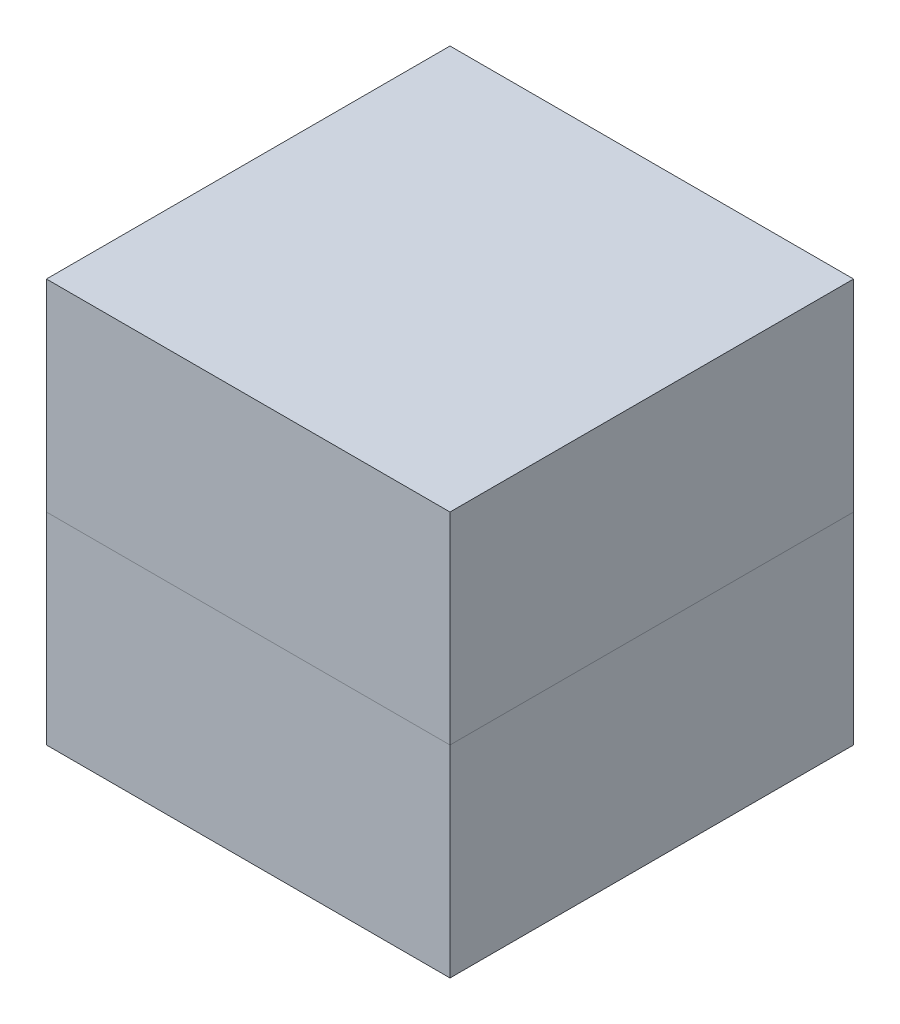
ISO-10303-21;
HEADER;
FILE_DESCRIPTION(('STEP AP214'),'2;1');
FILE_NAME('part.step','',(''),(''),'','','');
FILE_SCHEMA(('AUTOMOTIVE_DESIGN { 1 0 10303 214 1 1 1 1 }'));
ENDSEC;
DATA;
#1=APPLICATION_CONTEXT('core data for automotive mechanical design processes');
#2=APPLICATION_PROTOCOL_DEFINITION('international standard','automotive_design',2000,#1);
#3=PRODUCT_CONTEXT('',#1,'mechanical');
#4=PRODUCT('Part','Part','',(#3));
#5=PRODUCT_RELATED_PRODUCT_CATEGORY('part','',(#4));
#6=PRODUCT_DEFINITION_FORMATION('','',#4);
#7=PRODUCT_DEFINITION_CONTEXT('part definition',#1,'design');
#8=PRODUCT_DEFINITION('design','',#6,#7);
#9=PRODUCT_DEFINITION_SHAPE('','',#8);
#10=(LENGTH_UNIT() NAMED_UNIT(*) SI_UNIT(.MILLI.,.METRE.));
#11=(NAMED_UNIT(*) PLANE_ANGLE_UNIT() SI_UNIT($,.RADIAN.));
#12=(NAMED_UNIT(*) SI_UNIT($,.STERADIAN.) SOLID_ANGLE_UNIT());
#13=UNCERTAINTY_MEASURE_WITH_UNIT(LENGTH_MEASURE(1.E-05),#10,'distance_accuracy_value','');
#14=(GEOMETRIC_REPRESENTATION_CONTEXT(3) GLOBAL_UNCERTAINTY_ASSIGNED_CONTEXT((#13)) GLOBAL_UNIT_ASSIGNED_CONTEXT((#10,
#11,#12)) REPRESENTATION_CONTEXT('',''));
#15=CARTESIAN_POINT('',(0.,0.,0.));
#16=DIRECTION('',(0.,0.,1.));
#17=DIRECTION('',(1.,0.,0.));
#18=AXIS2_PLACEMENT_3D('',#15,#16,#17);
#19=CARTESIAN_POINT('',(0.,-50.,0.));
#20=DIRECTION('',(0.,-1.,0.));
#21=DIRECTION('',(0.,0.,-1.));
#22=AXIS2_PLACEMENT_3D('',#19,#20,#21);
#23=PLANE('',#22);
#24=DIRECTION('',(0.,0.,1.));
#25=VECTOR('',#24,1.);
#26=CARTESIAN_POINT('',(50.,-50.,50.));
#27=LINE('',#26,#25);
#28=CARTESIAN_POINT('',(50.,-50.,-50.));
#29=VERTEX_POINT('',#28);
#30=CARTESIAN_POINT('',(50.,-50.,50.));
#31=VERTEX_POINT('',#30);
#32=EDGE_CURVE('E184',#29,#31,#27,.T.);
#33=ORIENTED_EDGE('',*,*,#32,.T.);
#34=DIRECTION('',(-1.,0.,0.));
#35=VECTOR('',#34,1.);
#36=CARTESIAN_POINT('',(-50.,-50.,50.));
#37=LINE('',#36,#35);
#38=CARTESIAN_POINT('',(-50.,-50.,50.));
#39=VERTEX_POINT('',#38);
#40=EDGE_CURVE('E191',#31,#39,#37,.T.);
#41=ORIENTED_EDGE('',*,*,#40,.T.);
#42=DIRECTION('',(0.,0.,-1.));
#43=VECTOR('',#42,1.);
#44=CARTESIAN_POINT('',(-50.,-50.,50.));
#45=LINE('',#44,#43);
#46=CARTESIAN_POINT('',(-50.,-50.,-50.));
#47=VERTEX_POINT('',#46);
#48=EDGE_CURVE('E197',#39,#47,#45,.T.);
#49=ORIENTED_EDGE('',*,*,#48,.T.);
#50=DIRECTION('',(1.,0.,0.));
#51=VECTOR('',#50,1.);
#52=CARTESIAN_POINT('',(-50.,-50.,-50.));
#53=LINE('',#52,#51);
#54=EDGE_CURVE('E189',#47,#29,#53,.T.);
#55=ORIENTED_EDGE('',*,*,#54,.T.);
#56=EDGE_LOOP('',(#33,#41,#49,#55));
#57=FACE_BOUND('',#56,.T.);
#58=ADVANCED_FACE('F138',(#57),#23,.T.);
#59=CARTESIAN_POINT('',(-50.,50.,50.));
#60=DIRECTION('',(0.,0.,1.));
#61=DIRECTION('',(0.,-1.,0.));
#62=AXIS2_PLACEMENT_3D('',#59,#60,#61);
#63=PLANE('',#62);
#64=DIRECTION('',(0.,-1.,0.));
#65=VECTOR('',#64,1.);
#66=CARTESIAN_POINT('',(50.,50.,50.));
#67=LINE('',#66,#65);
#68=CARTESIAN_POINT('',(50.,0.,50.));
#69=VERTEX_POINT('',#68);
#70=EDGE_CURVE('E180',#69,#31,#67,.T.);
#71=ORIENTED_EDGE('',*,*,#70,.F.);
#72=DIRECTION('',(-1.,0.,0.));
#73=VECTOR('',#72,1.);
#74=CARTESIAN_POINT('',(-50.,0.,50.));
#75=LINE('',#74,#73);
#76=CARTESIAN_POINT('',(-50.,0.,50.));
#77=VERTEX_POINT('',#76);
#78=EDGE_CURVE('E142',#69,#77,#75,.T.);
#79=ORIENTED_EDGE('',*,*,#78,.T.);
#80=DIRECTION('',(0.,-1.,0.));
#81=VECTOR('',#80,1.);
#82=CARTESIAN_POINT('',(-50.,50.,50.));
#83=LINE('',#82,#81);
#84=EDGE_CURVE('E188',#77,#39,#83,.T.);
#85=ORIENTED_EDGE('',*,*,#84,.T.);
#86=ORIENTED_EDGE('',*,*,#40,.F.);
#87=EDGE_LOOP('',(#71,#79,#85,#86));
#88=FACE_BOUND('',#87,.T.);
#89=ADVANCED_FACE('F192',(#88),#63,.T.);
#90=CARTESIAN_POINT('',(-50.,50.,50.));
#91=DIRECTION('',(-1.,0.,0.));
#92=DIRECTION('',(0.,0.,1.));
#93=AXIS2_PLACEMENT_3D('',#90,#91,#92);
#94=PLANE('',#93);
#95=ORIENTED_EDGE('',*,*,#84,.F.);
#96=DIRECTION('',(0.,0.,-1.));
#97=VECTOR('',#96,1.);
#98=CARTESIAN_POINT('',(-50.,0.,50.));
#99=LINE('',#98,#97);
#100=CARTESIAN_POINT('',(-50.,0.,-50.));
#101=VERTEX_POINT('',#100);
#102=EDGE_CURVE('E213',#77,#101,#99,.T.);
#103=ORIENTED_EDGE('',*,*,#102,.T.);
#104=DIRECTION('',(0.,-1.,0.));
#105=VECTOR('',#104,1.);
#106=CARTESIAN_POINT('',(-50.,50.,-50.));
#107=LINE('',#106,#105);
#108=EDGE_CURVE('E208',#101,#47,#107,.T.);
#109=ORIENTED_EDGE('',*,*,#108,.T.);
#110=ORIENTED_EDGE('',*,*,#48,.F.);
#111=EDGE_LOOP('',(#95,#103,#109,#110));
#112=FACE_BOUND('',#111,.T.);
#113=ADVANCED_FACE('F212',(#112),#94,.T.);
#114=CARTESIAN_POINT('',(-50.,50.,-50.));
#115=DIRECTION('',(0.,0.,-1.));
#116=DIRECTION('',(0.,1.,0.));
#117=AXIS2_PLACEMENT_3D('',#114,#115,#116);
#118=PLANE('',#117);
#119=ORIENTED_EDGE('',*,*,#108,.F.);
#120=DIRECTION('',(1.,0.,0.));
#121=VECTOR('',#120,1.);
#122=CARTESIAN_POINT('',(-50.,0.,-50.));
#123=LINE('',#122,#121);
#124=CARTESIAN_POINT('',(50.,0.,-50.));
#125=VERTEX_POINT('',#124);
#126=EDGE_CURVE('E160',#101,#125,#123,.T.);
#127=ORIENTED_EDGE('',*,*,#126,.T.);
#128=DIRECTION('',(0.,-1.,0.));
#129=VECTOR('',#128,1.);
#130=CARTESIAN_POINT('',(50.,50.,-50.));
#131=LINE('',#130,#129);
#132=EDGE_CURVE('E206',#125,#29,#131,.T.);
#133=ORIENTED_EDGE('',*,*,#132,.T.);
#134=ORIENTED_EDGE('',*,*,#54,.F.);
#135=EDGE_LOOP('',(#119,#127,#133,#134));
#136=FACE_BOUND('',#135,.T.);
#137=ADVANCED_FACE('F215',(#136),#118,.T.);
#138=CARTESIAN_POINT('',(50.,50.,50.));
#139=DIRECTION('',(1.,0.,0.));
#140=DIRECTION('',(0.,0.,-1.));
#141=AXIS2_PLACEMENT_3D('',#138,#139,#140);
#142=PLANE('',#141);
#143=ORIENTED_EDGE('',*,*,#132,.F.);
#144=DIRECTION('',(0.,0.,1.));
#145=VECTOR('',#144,1.);
#146=CARTESIAN_POINT('',(50.,0.,50.));
#147=LINE('',#146,#145);
#148=EDGE_CURVE('E186',#125,#69,#147,.T.);
#149=ORIENTED_EDGE('',*,*,#148,.T.);
#150=ORIENTED_EDGE('',*,*,#70,.T.);
#151=ORIENTED_EDGE('',*,*,#32,.F.);
#152=EDGE_LOOP('',(#143,#149,#150,#151));
#153=FACE_BOUND('',#152,.T.);
#154=ADVANCED_FACE('F140',(#153),#142,.T.);
#155=CARTESIAN_POINT('',(0.,-4.,0.));
#156=DIRECTION('',(0.,-1.,0.));
#157=DIRECTION('',(0.,0.,-1.));
#158=AXIS2_PLACEMENT_3D('',#155,#156,#157);
#159=PLANE('',#158);
#160=CARTESIAN_POINT('',(0.,-4.,0.));
#161=DIRECTION('',(0.,1.,0.));
#162=DIRECTION('',(0.,0.,1.));
#163=AXIS2_PLACEMENT_3D('',#160,#161,#162);
#164=CIRCLE('',#163,20.);
#165=CARTESIAN_POINT('',(0.,-4.,20.));
#166=VERTEX_POINT('',#165);
#167=EDGE_CURVE('E148',#166,#166,#164,.T.);
#168=ORIENTED_EDGE('',*,*,#167,.T.);
#169=EDGE_LOOP('',(#168));
#170=FACE_BOUND('',#169,.T.);
#171=ADVANCED_FACE('F223',(#170),#159,.F.);
#172=CARTESIAN_POINT('',(0.,0.,0.));
#173=DIRECTION('',(0.,1.,0.));
#174=DIRECTION('',(0.,0.,1.));
#175=AXIS2_PLACEMENT_3D('',#172,#173,#174);
#176=TOROIDAL_SURFACE('',#175,26.9282032302755,8.);
#177=ORIENTED_EDGE('',*,*,#167,.F.);
#178=EDGE_LOOP('',(#177));
#179=FACE_BOUND('',#178,.T.);
#180=CARTESIAN_POINT('',(0.,0.,0.));
#181=DIRECTION('',(0.,1.,0.));
#182=DIRECTION('',(0.,0.,1.));
#183=AXIS2_PLACEMENT_3D('',#180,#181,#182);
#184=CIRCLE('',#183,34.9282032302755);
#185=CARTESIAN_POINT('',(0.,0.,34.9282032302755));
#186=VERTEX_POINT('',#185);
#187=EDGE_CURVE('E14',#186,#186,#184,.F.);
#188=ORIENTED_EDGE('',*,*,#187,.F.);
#189=EDGE_LOOP('',(#188));
#190=FACE_BOUND('',#189,.T.);
#191=ADVANCED_FACE('F225',(#179,#190),#176,.F.);
#192=CARTESIAN_POINT('',(-0.691677888563921,0.,-34.9282042538482));
#193=DIRECTION('',(0.,1.,0.));
#194=DIRECTION('',(0.999999999998905,0.,1.47984009039946E-06));
#195=AXIS2_PLACEMENT_3D('',#192,#193,#194);
#196=PLANE('',#195);
#197=ORIENTED_EDGE('',*,*,#126,.F.);
#198=ORIENTED_EDGE('',*,*,#102,.F.);
#199=ORIENTED_EDGE('',*,*,#78,.F.);
#200=ORIENTED_EDGE('',*,*,#148,.F.);
#201=EDGE_LOOP('',(#197,#198,#199,#200));
#202=FACE_BOUND('',#201,.T.);
#203=ORIENTED_EDGE('',*,*,#187,.T.);
#204=EDGE_LOOP('',(#203));
#205=FACE_BOUND('',#204,.T.);
#206=ADVANCED_FACE('F228',(#202,#205),#196,.T.);
#207=CLOSED_SHELL('',(#58,#89,#113,#137,#154,#171,#191,#206));
#208=MANIFOLD_SOLID_BREP('B2',#207);
#209=CARTESIAN_POINT('',(50.,50.,50.));
#210=DIRECTION('',(1.,0.,0.));
#211=DIRECTION('',(0.,0.,-1.));
#212=AXIS2_PLACEMENT_3D('',#209,#210,#211);
#213=PLANE('',#212);
#214=DIRECTION('',(0.,0.,1.));
#215=VECTOR('',#214,1.);
#216=CARTESIAN_POINT('',(50.,0.,50.));
#217=LINE('',#216,#215);
#218=CARTESIAN_POINT('',(50.,0.,-50.));
#219=VERTEX_POINT('',#218);
#220=CARTESIAN_POINT('',(50.,0.,50.));
#221=VERTEX_POINT('',#220);
#222=EDGE_CURVE('E413',#219,#221,#217,.T.);
#223=ORIENTED_EDGE('',*,*,#222,.F.);
#224=DIRECTION('',(0.,-1.,0.));
#225=VECTOR('',#224,1.);
#226=CARTESIAN_POINT('',(50.,50.,-50.));
#227=LINE('',#226,#225);
#228=CARTESIAN_POINT('',(50.,50.,-50.));
#229=VERTEX_POINT('',#228);
#230=EDGE_CURVE('E432',#229,#219,#227,.T.);
#231=ORIENTED_EDGE('',*,*,#230,.F.);
#232=DIRECTION('',(0.,0.,1.));
#233=VECTOR('',#232,1.);
#234=CARTESIAN_POINT('',(50.,50.,50.));
#235=LINE('',#234,#233);
#236=CARTESIAN_POINT('',(50.,50.,50.));
#237=VERTEX_POINT('',#236);
#238=EDGE_CURVE('E416',#229,#237,#235,.T.);
#239=ORIENTED_EDGE('',*,*,#238,.T.);
#240=DIRECTION('',(0.,-1.,0.));
#241=VECTOR('',#240,1.);
#242=CARTESIAN_POINT('',(50.,50.,50.));
#243=LINE('',#242,#241);
#244=EDGE_CURVE('E393',#237,#221,#243,.T.);
#245=ORIENTED_EDGE('',*,*,#244,.T.);
#246=EDGE_LOOP('',(#223,#231,#239,#245));
#247=FACE_BOUND('',#246,.T.);
#248=ADVANCED_FACE('F370',(#247),#213,.T.);
#249=CARTESIAN_POINT('',(-50.,50.,-50.));
#250=DIRECTION('',(0.,0.,-1.));
#251=DIRECTION('',(0.,1.,0.));
#252=AXIS2_PLACEMENT_3D('',#249,#250,#251);
#253=PLANE('',#252);
#254=DIRECTION('',(1.,0.,0.));
#255=VECTOR('',#254,1.);
#256=CARTESIAN_POINT('',(-50.,0.,-50.));
#257=LINE('',#256,#255);
#258=CARTESIAN_POINT('',(-50.,0.,-50.));
#259=VERTEX_POINT('',#258);
#260=EDGE_CURVE('E424',#259,#219,#257,.T.);
#261=ORIENTED_EDGE('',*,*,#260,.F.);
#262=DIRECTION('',(0.,-1.,0.));
#263=VECTOR('',#262,1.);
#264=CARTESIAN_POINT('',(-50.,50.,-50.));
#265=LINE('',#264,#263);
#266=CARTESIAN_POINT('',(-50.,50.,-50.));
#267=VERTEX_POINT('',#266);
#268=EDGE_CURVE('E435',#267,#259,#265,.T.);
#269=ORIENTED_EDGE('',*,*,#268,.F.);
#270=DIRECTION('',(1.,0.,0.));
#271=VECTOR('',#270,1.);
#272=CARTESIAN_POINT('',(-50.,50.,-50.));
#273=LINE('',#272,#271);
#274=EDGE_CURVE('E417',#267,#229,#273,.T.);
#275=ORIENTED_EDGE('',*,*,#274,.T.);
#276=ORIENTED_EDGE('',*,*,#230,.T.);
#277=EDGE_LOOP('',(#261,#269,#275,#276));
#278=FACE_BOUND('',#277,.T.);
#279=ADVANCED_FACE('F499',(#278),#253,.T.);
#280=CARTESIAN_POINT('',(-50.,50.,50.));
#281=DIRECTION('',(-1.,0.,0.));
#282=DIRECTION('',(0.,0.,1.));
#283=AXIS2_PLACEMENT_3D('',#280,#281,#282);
#284=PLANE('',#283);
#285=DIRECTION('',(0.,0.,-1.));
#286=VECTOR('',#285,1.);
#287=CARTESIAN_POINT('',(-50.,0.,50.));
#288=LINE('',#287,#286);
#289=CARTESIAN_POINT('',(-50.,0.,50.));
#290=VERTEX_POINT('',#289);
#291=EDGE_CURVE('E136',#290,#259,#288,.T.);
#292=ORIENTED_EDGE('',*,*,#291,.F.);
#293=DIRECTION('',(0.,-1.,0.));
#294=VECTOR('',#293,1.);
#295=CARTESIAN_POINT('',(-50.,50.,50.));
#296=LINE('',#295,#294);
#297=CARTESIAN_POINT('',(-50.,50.,50.));
#298=VERTEX_POINT('',#297);
#299=EDGE_CURVE('E388',#298,#290,#296,.T.);
#300=ORIENTED_EDGE('',*,*,#299,.F.);
#301=DIRECTION('',(0.,0.,-1.));
#302=VECTOR('',#301,1.);
#303=CARTESIAN_POINT('',(-50.,50.,50.));
#304=LINE('',#303,#302);
#305=EDGE_CURVE('E434',#298,#267,#304,.T.);
#306=ORIENTED_EDGE('',*,*,#305,.T.);
#307=ORIENTED_EDGE('',*,*,#268,.T.);
#308=EDGE_LOOP('',(#292,#300,#306,#307));
#309=FACE_BOUND('',#308,.T.);
#310=ADVANCED_FACE('F503',(#309),#284,.T.);
#311=CARTESIAN_POINT('',(-50.,50.,50.));
#312=DIRECTION('',(0.,0.,1.));
#313=DIRECTION('',(0.,-1.,0.));
#314=AXIS2_PLACEMENT_3D('',#311,#312,#313);
#315=PLANE('',#314);
#316=DIRECTION('',(-1.,0.,0.));
#317=VECTOR('',#316,1.);
#318=CARTESIAN_POINT('',(-50.,0.,50.));
#319=LINE('',#318,#317);
#320=EDGE_CURVE('E380',#221,#290,#319,.T.);
#321=ORIENTED_EDGE('',*,*,#320,.F.);
#322=ORIENTED_EDGE('',*,*,#244,.F.);
#323=DIRECTION('',(-1.,0.,0.));
#324=VECTOR('',#323,1.);
#325=CARTESIAN_POINT('',(-50.,50.,50.));
#326=LINE('',#325,#324);
#327=EDGE_CURVE('E438',#237,#298,#326,.T.);
#328=ORIENTED_EDGE('',*,*,#327,.T.);
#329=ORIENTED_EDGE('',*,*,#299,.T.);
#330=EDGE_LOOP('',(#321,#322,#328,#329));
#331=FACE_BOUND('',#330,.T.);
#332=ADVANCED_FACE('F419',(#331),#315,.T.);
#333=CARTESIAN_POINT('',(0.,50.,0.));
#334=DIRECTION('',(0.,-1.,0.));
#335=DIRECTION('',(0.,0.,-1.));
#336=AXIS2_PLACEMENT_3D('',#333,#334,#335);
#337=PLANE('',#336);
#338=ORIENTED_EDGE('',*,*,#238,.F.);
#339=ORIENTED_EDGE('',*,*,#274,.F.);
#340=ORIENTED_EDGE('',*,*,#305,.F.);
#341=ORIENTED_EDGE('',*,*,#327,.F.);
#342=EDGE_LOOP('',(#338,#339,#340,#341));
#343=FACE_BOUND('',#342,.T.);
#344=ADVANCED_FACE('F488',(#343),#337,.F.);
#345=CARTESIAN_POINT('',(0.,-4.,0.));
#346=DIRECTION('',(0.,-1.,0.));
#347=DIRECTION('',(0.,0.,-1.));
#348=AXIS2_PLACEMENT_3D('',#345,#346,#347);
#349=PLANE('',#348);
#350=CARTESIAN_POINT('',(-8.,-4.,-8.));
#351=DIRECTION('',(0.,-1.,0.));
#352=DIRECTION('',(0.,0.,-1.));
#353=AXIS2_PLACEMENT_3D('',#350,#351,#352);
#354=CIRCLE('',#353,3.86035948057426);
#355=CARTESIAN_POINT('',(-8.,-4.,-11.8603594805743));
#356=VERTEX_POINT('',#355);
#357=EDGE_CURVE('E429',#356,#356,#354,.F.);
#358=ORIENTED_EDGE('',*,*,#357,.F.);
#359=EDGE_LOOP('',(#358));
#360=FACE_BOUND('',#359,.T.);
#361=ADVANCED_FACE('F483',(#360),#349,.T.);
#362=CARTESIAN_POINT('',(-8.,4.,-8.));
#363=DIRECTION('',(0.,1.,0.));
#364=DIRECTION('',(0.,0.,1.));
#365=AXIS2_PLACEMENT_3D('',#362,#363,#364);
#366=CONICAL_SURFACE('',#365,4.,0.0174532925199433);
#367=CARTESIAN_POINT('',(-8.,4.,-8.));
#368=DIRECTION('',(0.,1.,0.));
#369=DIRECTION('',(0.,0.,1.));
#370=AXIS2_PLACEMENT_3D('',#367,#368,#369);
#371=CIRCLE('',#370,4.);
#372=CARTESIAN_POINT('',(-8.,4.,-4.));
#373=VERTEX_POINT('',#372);
#374=EDGE_CURVE('E451',#373,#373,#371,.T.);
#375=ORIENTED_EDGE('',*,*,#374,.F.);
#376=EDGE_LOOP('',(#375));
#377=FACE_BOUND('',#376,.T.);
#378=ORIENTED_EDGE('',*,*,#357,.T.);
#379=EDGE_LOOP('',(#378));
#380=FACE_BOUND('',#379,.T.);
#381=ADVANCED_FACE('F479',(#377,#380),#366,.T.);
#382=CARTESIAN_POINT('',(8.00000000000003,4.,-7.99999999999997));
#383=DIRECTION('',(0.,1.,0.));
#384=DIRECTION('',(0.,0.,1.));
#385=AXIS2_PLACEMENT_3D('',#382,#383,#384);
#386=CONICAL_SURFACE('',#385,4.,0.0174532925199433);
#387=CARTESIAN_POINT('',(8.00000000000003,4.,-7.99999999999997));
#388=DIRECTION('',(0.,1.,0.));
#389=DIRECTION('',(0.,0.,1.));
#390=AXIS2_PLACEMENT_3D('',#387,#388,#389);
#391=CIRCLE('',#390,4.);
#392=CARTESIAN_POINT('',(8.00000000000003,4.,-3.99999999999997));
#393=VERTEX_POINT('',#392);
#394=EDGE_CURVE('E468',#393,#393,#391,.T.);
#395=ORIENTED_EDGE('',*,*,#394,.F.);
#396=EDGE_LOOP('',(#395));
#397=FACE_BOUND('',#396,.T.);
#398=CARTESIAN_POINT('',(8.00000000000003,-4.,-7.99999999999997));
#399=DIRECTION('',(0.,1.,0.));
#400=DIRECTION('',(0.,0.,1.));
#401=AXIS2_PLACEMENT_3D('',#398,#399,#400);
#402=CIRCLE('',#401,3.86035948057426);
#403=CARTESIAN_POINT('',(8.00000000000003,-4.,-4.13964051942571));
#404=VERTEX_POINT('',#403);
#405=EDGE_CURVE('E441',#404,#404,#402,.T.);
#406=ORIENTED_EDGE('',*,*,#405,.T.);
#407=EDGE_LOOP('',(#406));
#408=FACE_BOUND('',#407,.T.);
#409=ADVANCED_FACE('F482',(#397,#408),#386,.T.);
#410=CARTESIAN_POINT('',(7.99999999999994,4.,8.00000000000006));
#411=DIRECTION('',(0.,1.,0.));
#412=DIRECTION('',(0.,0.,1.));
#413=AXIS2_PLACEMENT_3D('',#410,#411,#412);
#414=CONICAL_SURFACE('',#413,4.,0.0174532925199433);
#415=CARTESIAN_POINT('',(7.99999999999994,4.,8.00000000000006));
#416=DIRECTION('',(0.,1.,0.));
#417=DIRECTION('',(0.,0.,1.));
#418=AXIS2_PLACEMENT_3D('',#415,#416,#417);
#419=CIRCLE('',#418,4.);
#420=CARTESIAN_POINT('',(7.99999999999994,4.,12.0000000000001));
#421=VERTEX_POINT('',#420);
#422=EDGE_CURVE('E462',#421,#421,#419,.T.);
#423=ORIENTED_EDGE('',*,*,#422,.F.);
#424=EDGE_LOOP('',(#423));
#425=FACE_BOUND('',#424,.T.);
#426=CARTESIAN_POINT('',(7.99999999999994,-4.,8.00000000000006));
#427=DIRECTION('',(0.,1.,0.));
#428=DIRECTION('',(0.,0.,1.));
#429=AXIS2_PLACEMENT_3D('',#426,#427,#428);
#430=CIRCLE('',#429,3.86035948057426);
#431=CARTESIAN_POINT('',(7.99999999999994,-4.,11.8603594805743));
#432=VERTEX_POINT('',#431);
#433=EDGE_CURVE('E459',#432,#432,#430,.T.);
#434=ORIENTED_EDGE('',*,*,#433,.T.);
#435=EDGE_LOOP('',(#434));
#436=FACE_BOUND('',#435,.T.);
#437=ADVANCED_FACE('F562',(#425,#436),#414,.T.);
#438=CARTESIAN_POINT('',(-8.00000000000008,4.,7.99999999999992));
#439=DIRECTION('',(0.,1.,0.));
#440=DIRECTION('',(0.,0.,1.));
#441=AXIS2_PLACEMENT_3D('',#438,#439,#440);
#442=CONICAL_SURFACE('',#441,4.,0.0174532925199433);
#443=CARTESIAN_POINT('',(-8.00000000000008,4.,7.99999999999992));
#444=DIRECTION('',(0.,1.,0.));
#445=DIRECTION('',(0.,0.,1.));
#446=AXIS2_PLACEMENT_3D('',#443,#444,#445);
#447=CIRCLE('',#446,4.);
#448=CARTESIAN_POINT('',(-8.00000000000008,4.,11.9999999999999));
#449=VERTEX_POINT('',#448);
#450=EDGE_CURVE('E458',#449,#449,#447,.T.);
#451=ORIENTED_EDGE('',*,*,#450,.F.);
#452=EDGE_LOOP('',(#451));
#453=FACE_BOUND('',#452,.T.);
#454=CARTESIAN_POINT('',(-8.00000000000008,-4.,7.99999999999992));
#455=DIRECTION('',(0.,1.,0.));
#456=DIRECTION('',(0.,0.,1.));
#457=AXIS2_PLACEMENT_3D('',#454,#455,#456);
#458=CIRCLE('',#457,3.86035948057426);
#459=CARTESIAN_POINT('',(-8.00000000000008,-4.,11.8603594805742));
#460=VERTEX_POINT('',#459);
#461=EDGE_CURVE('E454',#460,#460,#458,.T.);
#462=ORIENTED_EDGE('',*,*,#461,.T.);
#463=EDGE_LOOP('',(#462));
#464=FACE_BOUND('',#463,.T.);
#465=ADVANCED_FACE('F573',(#453,#464),#442,.T.);
#466=CARTESIAN_POINT('',(0.,4.,0.));
#467=DIRECTION('',(0.,-1.,0.));
#468=DIRECTION('',(0.,0.,-1.));
#469=AXIS2_PLACEMENT_3D('',#466,#467,#468);
#470=PLANE('',#469);
#471=ORIENTED_EDGE('',*,*,#450,.T.);
#472=EDGE_LOOP('',(#471));
#473=FACE_BOUND('',#472,.T.);
#474=ORIENTED_EDGE('',*,*,#422,.T.);
#475=EDGE_LOOP('',(#474));
#476=FACE_BOUND('',#475,.T.);
#477=ORIENTED_EDGE('',*,*,#394,.T.);
#478=EDGE_LOOP('',(#477));
#479=FACE_BOUND('',#478,.T.);
#480=ORIENTED_EDGE('',*,*,#374,.T.);
#481=EDGE_LOOP('',(#480));
#482=FACE_BOUND('',#481,.T.);
#483=CARTESIAN_POINT('',(0.,4.,0.));
#484=DIRECTION('',(0.,1.,0.));
#485=DIRECTION('',(0.,0.,1.));
#486=AXIS2_PLACEMENT_3D('',#483,#484,#485);
#487=CIRCLE('',#486,20.);
#488=CARTESIAN_POINT('',(0.,4.,20.));
#489=VERTEX_POINT('',#488);
#490=EDGE_CURVE('E426',#489,#489,#487,.T.);
#491=ORIENTED_EDGE('',*,*,#490,.F.);
#492=EDGE_LOOP('',(#491));
#493=FACE_BOUND('',#492,.T.);
#494=ADVANCED_FACE('F476',(#473,#476,#479,#482,#493),#470,.T.);
#495=CARTESIAN_POINT('',(0.,0.,0.));
#496=DIRECTION('',(0.,1.,0.));
#497=DIRECTION('',(0.,0.,1.));
#498=AXIS2_PLACEMENT_3D('',#495,#496,#497);
#499=TOROIDAL_SURFACE('',#498,26.9282032302755,8.);
#500=CARTESIAN_POINT('',(0.,0.,0.));
#501=DIRECTION('',(0.,1.,0.));
#502=DIRECTION('',(0.,0.,1.));
#503=AXIS2_PLACEMENT_3D('',#500,#501,#502);
#504=CIRCLE('',#503,34.9282032302755);
#505=CARTESIAN_POINT('',(0.,0.,34.9282032302755));
#506=VERTEX_POINT('',#505);
#507=EDGE_CURVE('E447',#506,#506,#504,.F.);
#508=ORIENTED_EDGE('',*,*,#507,.T.);
#509=EDGE_LOOP('',(#508));
#510=FACE_BOUND('',#509,.T.);
#511=ORIENTED_EDGE('',*,*,#490,.T.);
#512=EDGE_LOOP('',(#511));
#513=FACE_BOUND('',#512,.T.);
#514=ADVANCED_FACE('F594',(#510,#513),#499,.F.);
#515=CARTESIAN_POINT('',(0.,-4.,0.));
#516=DIRECTION('',(0.,-1.,0.));
#517=DIRECTION('',(0.,0.,-1.));
#518=AXIS2_PLACEMENT_3D('',#515,#516,#517);
#519=PLANE('',#518);
#520=ORIENTED_EDGE('',*,*,#405,.F.);
#521=EDGE_LOOP('',(#520));
#522=FACE_BOUND('',#521,.T.);
#523=ADVANCED_FACE('F604',(#522),#519,.T.);
#524=CARTESIAN_POINT('',(0.,-4.,0.));
#525=DIRECTION('',(0.,-1.,0.));
#526=DIRECTION('',(0.,0.,-1.));
#527=AXIS2_PLACEMENT_3D('',#524,#525,#526);
#528=PLANE('',#527);
#529=ORIENTED_EDGE('',*,*,#433,.F.);
#530=EDGE_LOOP('',(#529));
#531=FACE_BOUND('',#530,.T.);
#532=ADVANCED_FACE('F624',(#531),#528,.T.);
#533=CARTESIAN_POINT('',(0.,-4.,0.));
#534=DIRECTION('',(0.,-1.,0.));
#535=DIRECTION('',(0.,0.,-1.));
#536=AXIS2_PLACEMENT_3D('',#533,#534,#535);
#537=PLANE('',#536);
#538=ORIENTED_EDGE('',*,*,#461,.F.);
#539=EDGE_LOOP('',(#538));
#540=FACE_BOUND('',#539,.T.);
#541=ADVANCED_FACE('F632',(#540),#537,.T.);
#542=CARTESIAN_POINT('',(-0.691677888563921,0.,-34.9282042538482));
#543=DIRECTION('',(0.,1.,0.));
#544=DIRECTION('',(0.999999999998905,0.,1.47984009039946E-06));
#545=AXIS2_PLACEMENT_3D('',#542,#543,#544);
#546=PLANE('',#545);
#547=ORIENTED_EDGE('',*,*,#260,.T.);
#548=ORIENTED_EDGE('',*,*,#222,.T.);
#549=ORIENTED_EDGE('',*,*,#320,.T.);
#550=ORIENTED_EDGE('',*,*,#291,.T.);
#551=EDGE_LOOP('',(#547,#548,#549,#550));
#552=FACE_BOUND('',#551,.T.);
#553=ORIENTED_EDGE('',*,*,#507,.F.);
#554=EDGE_LOOP('',(#553));
#555=FACE_BOUND('',#554,.T.);
#556=ADVANCED_FACE('F372',(#552,#555),#546,.F.);
#557=CLOSED_SHELL('',(#248,#279,#310,#332,#344,#361,#381,#409,#437,#465,#494,#514,#523,#532,
#541,#556));
#558=MANIFOLD_SOLID_BREP('B8_NOT_SHOWN',#557);
#559=CARTESIAN_POINT('',(0.,0.,0.));
#560=DIRECTION('',(0.,1.,0.));
#561=DIRECTION('',(0.,0.,1.));
#562=AXIS2_PLACEMENT_3D('',#559,#560,#561);
#563=TOROIDAL_SURFACE('',#562,26.9282032302755,8.);
#564=CARTESIAN_POINT('',(0.,-4.,0.));
#565=DIRECTION('',(0.,1.,0.));
#566=DIRECTION('',(0.,0.,1.));
#567=AXIS2_PLACEMENT_3D('',#564,#565,#566);
#568=CIRCLE('',#567,20.);
#569=CARTESIAN_POINT('',(0.,-4.,20.));
#570=VERTEX_POINT('',#569);
#571=EDGE_CURVE('E763',#570,#570,#568,.T.);
#572=ORIENTED_EDGE('',*,*,#571,.T.);
#573=EDGE_LOOP('',(#572));
#574=FACE_BOUND('',#573,.T.);
#575=CARTESIAN_POINT('',(0.,0.,0.));
#576=DIRECTION('',(0.,-1.,0.));
#577=DIRECTION('',(0.,0.,-1.));
#578=AXIS2_PLACEMENT_3D('',#575,#576,#577);
#579=CIRCLE('',#578,34.9282032302755);
#580=CARTESIAN_POINT('',(0.,0.,-34.9282032302755));
#581=VERTEX_POINT('',#580);
#582=EDGE_CURVE('E369',#581,#581,#579,.T.);
#583=ORIENTED_EDGE('',*,*,#582,.T.);
#584=EDGE_LOOP('',(#583));
#585=FACE_BOUND('',#584,.T.);
#586=ADVANCED_FACE('F756',(#574,#585),#563,.T.);
#587=CARTESIAN_POINT('',(0.,-4.,0.));
#588=DIRECTION('',(0.,1.,0.));
#589=DIRECTION('',(0.,0.,1.));
#590=AXIS2_PLACEMENT_3D('',#587,#588,#589);
#591=PLANE('',#590);
#592=CARTESIAN_POINT('',(-8.00000000000008,-4.,7.99999999999992));
#593=DIRECTION('',(0.,1.,0.));
#594=DIRECTION('',(0.,0.,1.));
#595=AXIS2_PLACEMENT_3D('',#592,#593,#594);
#596=CIRCLE('',#595,3.86035948057426);
#597=CARTESIAN_POINT('',(-8.00000000000008,-4.,11.8603594805742));
#598=VERTEX_POINT('',#597);
#599=EDGE_CURVE('E772',#598,#598,#596,.T.);
#600=ORIENTED_EDGE('',*,*,#599,.T.);
#601=EDGE_LOOP('',(#600));
#602=FACE_BOUND('',#601,.T.);
#603=CARTESIAN_POINT('',(7.99999999999994,-4.,8.00000000000006));
#604=DIRECTION('',(0.,1.,0.));
#605=DIRECTION('',(0.,0.,1.));
#606=AXIS2_PLACEMENT_3D('',#603,#604,#605);
#607=CIRCLE('',#606,3.86035948057426);
#608=CARTESIAN_POINT('',(7.99999999999994,-4.,11.8603594805743));
#609=VERTEX_POINT('',#608);
#610=EDGE_CURVE('E776',#609,#609,#607,.T.);
#611=ORIENTED_EDGE('',*,*,#610,.T.);
#612=EDGE_LOOP('',(#611));
#613=FACE_BOUND('',#612,.T.);
#614=CARTESIAN_POINT('',(8.00000000000003,-4.,-7.99999999999997));
#615=DIRECTION('',(0.,1.,0.));
#616=DIRECTION('',(0.,0.,1.));
#617=AXIS2_PLACEMENT_3D('',#614,#615,#616);
#618=CIRCLE('',#617,3.86035948057426);
#619=CARTESIAN_POINT('',(8.00000000000003,-4.,-4.13964051942571));
#620=VERTEX_POINT('',#619);
#621=EDGE_CURVE('E779',#620,#620,#618,.T.);
#622=ORIENTED_EDGE('',*,*,#621,.T.);
#623=EDGE_LOOP('',(#622));
#624=FACE_BOUND('',#623,.T.);
#625=CARTESIAN_POINT('',(-8.,-4.,-8.));
#626=DIRECTION('',(0.,1.,0.));
#627=DIRECTION('',(0.,0.,1.));
#628=AXIS2_PLACEMENT_3D('',#625,#626,#627);
#629=CIRCLE('',#628,3.86035948057426);
#630=CARTESIAN_POINT('',(-8.,-4.,-4.13964051942574));
#631=VERTEX_POINT('',#630);
#632=EDGE_CURVE('E782',#631,#631,#629,.T.);
#633=ORIENTED_EDGE('',*,*,#632,.T.);
#634=EDGE_LOOP('',(#633));
#635=FACE_BOUND('',#634,.T.);
#636=ORIENTED_EDGE('',*,*,#571,.F.);
#637=EDGE_LOOP('',(#636));
#638=FACE_BOUND('',#637,.T.);
#639=ADVANCED_FACE('F788',(#602,#613,#624,#635,#638),#591,.F.);
#640=ORIENTED_EDGE('',*,*,#582,.F.);
#641=EDGE_LOOP('',(#640));
#642=FACE_BOUND('',#641,.T.);
#643=CARTESIAN_POINT('',(0.,4.,0.));
#644=DIRECTION('',(0.,1.,0.));
#645=DIRECTION('',(0.,0.,1.));
#646=AXIS2_PLACEMENT_3D('',#643,#644,#645);
#647=CIRCLE('',#646,20.);
#648=CARTESIAN_POINT('',(0.,4.,20.));
#649=VERTEX_POINT('',#648);
#650=EDGE_CURVE('E767',#649,#649,#647,.T.);
#651=ORIENTED_EDGE('',*,*,#650,.F.);
#652=EDGE_LOOP('',(#651));
#653=FACE_BOUND('',#652,.T.);
#654=ADVANCED_FACE('F808',(#642,#653),#563,.T.);
#655=CARTESIAN_POINT('',(0.,4.,0.));
#656=DIRECTION('',(0.,-1.,0.));
#657=DIRECTION('',(0.,0.,-1.));
#658=AXIS2_PLACEMENT_3D('',#655,#656,#657);
#659=PLANE('',#658);
#660=CARTESIAN_POINT('',(-8.00000000000008,4.,7.99999999999992));
#661=DIRECTION('',(0.,1.,0.));
#662=DIRECTION('',(0.,0.,1.));
#663=AXIS2_PLACEMENT_3D('',#660,#661,#662);
#664=CIRCLE('',#663,4.);
#665=CARTESIAN_POINT('',(-8.00000000000008,4.,11.9999999999999));
#666=VERTEX_POINT('',#665);
#667=EDGE_CURVE('E830',#666,#666,#664,.T.);
#668=ORIENTED_EDGE('',*,*,#667,.F.);
#669=EDGE_LOOP('',(#668));
#670=FACE_BOUND('',#669,.T.);
#671=CARTESIAN_POINT('',(7.99999999999994,4.,8.00000000000006));
#672=DIRECTION('',(0.,1.,0.));
#673=DIRECTION('',(0.,0.,1.));
#674=AXIS2_PLACEMENT_3D('',#671,#672,#673);
#675=CIRCLE('',#674,4.);
#676=CARTESIAN_POINT('',(7.99999999999994,4.,12.0000000000001));
#677=VERTEX_POINT('',#676);
#678=EDGE_CURVE('E834',#677,#677,#675,.T.);
#679=ORIENTED_EDGE('',*,*,#678,.F.);
#680=EDGE_LOOP('',(#679));
#681=FACE_BOUND('',#680,.T.);
#682=CARTESIAN_POINT('',(8.00000000000003,4.,-7.99999999999997));
#683=DIRECTION('',(0.,1.,0.));
#684=DIRECTION('',(0.,0.,1.));
#685=AXIS2_PLACEMENT_3D('',#682,#683,#684);
#686=CIRCLE('',#685,4.);
#687=CARTESIAN_POINT('',(8.00000000000003,4.,-3.99999999999997));
#688=VERTEX_POINT('',#687);
#689=EDGE_CURVE('E837',#688,#688,#686,.T.);
#690=ORIENTED_EDGE('',*,*,#689,.F.);
#691=EDGE_LOOP('',(#690));
#692=FACE_BOUND('',#691,.T.);
#693=CARTESIAN_POINT('',(-8.,4.,-8.));
#694=DIRECTION('',(0.,1.,0.));
#695=DIRECTION('',(0.,0.,1.));
#696=AXIS2_PLACEMENT_3D('',#693,#694,#695);
#697=CIRCLE('',#696,4.);
#698=CARTESIAN_POINT('',(-8.,4.,-4.));
#699=VERTEX_POINT('',#698);
#700=EDGE_CURVE('E784',#699,#699,#697,.T.);
#701=ORIENTED_EDGE('',*,*,#700,.F.);
#702=EDGE_LOOP('',(#701));
#703=FACE_BOUND('',#702,.T.);
#704=ORIENTED_EDGE('',*,*,#650,.T.);
#705=EDGE_LOOP('',(#704));
#706=FACE_BOUND('',#705,.T.);
#707=ADVANCED_FACE('F803',(#670,#681,#692,#703,#706),#659,.F.);
#708=CARTESIAN_POINT('',(-8.,4.,-8.));
#709=DIRECTION('',(0.,1.,0.));
#710=DIRECTION('',(0.,0.,1.));
#711=AXIS2_PLACEMENT_3D('',#708,#709,#710);
#712=CONICAL_SURFACE('',#711,4.,0.0174532925199433);
#713=ORIENTED_EDGE('',*,*,#700,.T.);
#714=EDGE_LOOP('',(#713));
#715=FACE_BOUND('',#714,.T.);
#716=ORIENTED_EDGE('',*,*,#632,.F.);
#717=EDGE_LOOP('',(#716));
#718=FACE_BOUND('',#717,.T.);
#719=ADVANCED_FACE('F794',(#715,#718),#712,.F.);
#720=CARTESIAN_POINT('',(8.00000000000003,4.,-7.99999999999997));
#721=DIRECTION('',(0.,1.,0.));
#722=DIRECTION('',(0.,0.,1.));
#723=AXIS2_PLACEMENT_3D('',#720,#721,#722);
#724=CONICAL_SURFACE('',#723,4.,0.0174532925199433);
#725=ORIENTED_EDGE('',*,*,#689,.T.);
#726=EDGE_LOOP('',(#725));
#727=FACE_BOUND('',#726,.T.);
#728=ORIENTED_EDGE('',*,*,#621,.F.);
#729=EDGE_LOOP('',(#728));
#730=FACE_BOUND('',#729,.T.);
#731=ADVANCED_FACE('F791',(#727,#730),#724,.F.);
#732=CARTESIAN_POINT('',(7.99999999999994,4.,8.00000000000006));
#733=DIRECTION('',(0.,1.,0.));
#734=DIRECTION('',(0.,0.,1.));
#735=AXIS2_PLACEMENT_3D('',#732,#733,#734);
#736=CONICAL_SURFACE('',#735,4.,0.0174532925199433);
#737=ORIENTED_EDGE('',*,*,#678,.T.);
#738=EDGE_LOOP('',(#737));
#739=FACE_BOUND('',#738,.T.);
#740=ORIENTED_EDGE('',*,*,#610,.F.);
#741=EDGE_LOOP('',(#740));
#742=FACE_BOUND('',#741,.T.);
#743=ADVANCED_FACE('F793',(#739,#742),#736,.F.);
#744=CARTESIAN_POINT('',(-8.00000000000008,4.,7.99999999999992));
#745=DIRECTION('',(0.,1.,0.));
#746=DIRECTION('',(0.,0.,1.));
#747=AXIS2_PLACEMENT_3D('',#744,#745,#746);
#748=CONICAL_SURFACE('',#747,4.,0.0174532925199433);
#749=ORIENTED_EDGE('',*,*,#667,.T.);
#750=EDGE_LOOP('',(#749));
#751=FACE_BOUND('',#750,.T.);
#752=ORIENTED_EDGE('',*,*,#599,.F.);
#753=EDGE_LOOP('',(#752));
#754=FACE_BOUND('',#753,.T.);
#755=ADVANCED_FACE('F758',(#751,#754),#748,.F.);
#756=CLOSED_SHELL('',(#586,#639,#654,#707,#719,#731,#743,#755));
#757=MANIFOLD_SOLID_BREP('B130',#756);
#758=CARTESIAN_POINT('',(0.,-4.,0.));
#759=DIRECTION('',(0.,-1.,0.));
#760=DIRECTION('',(0.,0.,-1.));
#761=AXIS2_PLACEMENT_3D('',#758,#759,#760);
#762=PLANE('',#761);
#763=CARTESIAN_POINT('',(-8.,-4.,-8.));
#764=DIRECTION('',(0.,-1.,0.));
#765=DIRECTION('',(0.,0.,-1.));
#766=AXIS2_PLACEMENT_3D('',#763,#764,#765);
#767=CIRCLE('',#766,3.86035948057426);
#768=CARTESIAN_POINT('',(-8.,-4.,-11.8603594805743));
#769=VERTEX_POINT('',#768);
#770=EDGE_CURVE('E934',#769,#769,#767,.F.);
#771=ORIENTED_EDGE('',*,*,#770,.F.);
#772=EDGE_LOOP('',(#771));
#773=FACE_BOUND('',#772,.T.);
#774=ADVANCED_FACE('F975',(#773),#762,.T.);
#775=CARTESIAN_POINT('',(-8.,4.,-8.));
#776=DIRECTION('',(0.,1.,0.));
#777=DIRECTION('',(0.,0.,1.));
#778=AXIS2_PLACEMENT_3D('',#775,#776,#777);
#779=CONICAL_SURFACE('',#778,4.,0.0174532925199433);
#780=CARTESIAN_POINT('',(-8.,4.,-8.));
#781=DIRECTION('',(0.,1.,0.));
#782=DIRECTION('',(0.,0.,1.));
#783=AXIS2_PLACEMENT_3D('',#780,#781,#782);
#784=CIRCLE('',#783,4.);
#785=CARTESIAN_POINT('',(-8.,4.,-4.));
#786=VERTEX_POINT('',#785);
#787=EDGE_CURVE('E1007',#786,#786,#784,.T.);
#788=ORIENTED_EDGE('',*,*,#787,.F.);
#789=EDGE_LOOP('',(#788));
#790=FACE_BOUND('',#789,.T.);
#791=ORIENTED_EDGE('',*,*,#770,.T.);
#792=EDGE_LOOP('',(#791));
#793=FACE_BOUND('',#792,.T.);
#794=ADVANCED_FACE('F1034',(#790,#793),#779,.T.);
#795=CARTESIAN_POINT('',(8.00000000000003,4.,-7.99999999999997));
#796=DIRECTION('',(0.,1.,0.));
#797=DIRECTION('',(0.,0.,1.));
#798=AXIS2_PLACEMENT_3D('',#795,#796,#797);
#799=CONICAL_SURFACE('',#798,4.,0.0174532925199433);
#800=CARTESIAN_POINT('',(8.00000000000003,4.,-7.99999999999997));
#801=DIRECTION('',(0.,1.,0.));
#802=DIRECTION('',(0.,0.,1.));
#803=AXIS2_PLACEMENT_3D('',#800,#801,#802);
#804=CIRCLE('',#803,4.);
#805=CARTESIAN_POINT('',(8.00000000000003,4.,-3.99999999999997));
#806=VERTEX_POINT('',#805);
#807=EDGE_CURVE('E1004',#806,#806,#804,.T.);
#808=ORIENTED_EDGE('',*,*,#807,.F.);
#809=EDGE_LOOP('',(#808));
#810=FACE_BOUND('',#809,.T.);
#811=CARTESIAN_POINT('',(8.00000000000003,-4.,-7.99999999999997));
#812=DIRECTION('',(0.,1.,0.));
#813=DIRECTION('',(0.,0.,1.));
#814=AXIS2_PLACEMENT_3D('',#811,#812,#813);
#815=CIRCLE('',#814,3.86035948057426);
#816=CARTESIAN_POINT('',(8.00000000000003,-4.,-4.13964051942571));
#817=VERTEX_POINT('',#816);
#818=EDGE_CURVE('E978',#817,#817,#815,.T.);
#819=ORIENTED_EDGE('',*,*,#818,.T.);
#820=EDGE_LOOP('',(#819));
#821=FACE_BOUND('',#820,.T.);
#822=ADVANCED_FACE('F1037',(#810,#821),#799,.T.);
#823=CARTESIAN_POINT('',(7.99999999999994,4.,8.00000000000006));
#824=DIRECTION('',(0.,1.,0.));
#825=DIRECTION('',(0.,0.,1.));
#826=AXIS2_PLACEMENT_3D('',#823,#824,#825);
#827=CONICAL_SURFACE('',#826,4.,0.0174532925199433);
#828=CARTESIAN_POINT('',(7.99999999999994,4.,8.00000000000006));
#829=DIRECTION('',(0.,1.,0.));
#830=DIRECTION('',(0.,0.,1.));
#831=AXIS2_PLACEMENT_3D('',#828,#829,#830);
#832=CIRCLE('',#831,4.);
#833=CARTESIAN_POINT('',(7.99999999999994,4.,12.0000000000001));
#834=VERTEX_POINT('',#833);
#835=EDGE_CURVE('E1001',#834,#834,#832,.T.);
#836=ORIENTED_EDGE('',*,*,#835,.F.);
#837=EDGE_LOOP('',(#836));
#838=FACE_BOUND('',#837,.T.);
#839=CARTESIAN_POINT('',(7.99999999999994,-4.,8.00000000000006));
#840=DIRECTION('',(0.,1.,0.));
#841=DIRECTION('',(0.,0.,1.));
#842=AXIS2_PLACEMENT_3D('',#839,#840,#841);
#843=CIRCLE('',#842,3.86035948057426);
#844=CARTESIAN_POINT('',(7.99999999999994,-4.,11.8603594805743));
#845=VERTEX_POINT('',#844);
#846=EDGE_CURVE('E990',#845,#845,#843,.T.);
#847=ORIENTED_EDGE('',*,*,#846,.T.);
#848=EDGE_LOOP('',(#847));
#849=FACE_BOUND('',#848,.T.);
#850=ADVANCED_FACE('F1020',(#838,#849),#827,.T.);
#851=CARTESIAN_POINT('',(-8.00000000000008,4.,7.99999999999992));
#852=DIRECTION('',(0.,1.,0.));
#853=DIRECTION('',(0.,0.,1.));
#854=AXIS2_PLACEMENT_3D('',#851,#852,#853);
#855=CONICAL_SURFACE('',#854,4.,0.0174532925199433);
#856=CARTESIAN_POINT('',(-8.00000000000008,4.,7.99999999999992));
#857=DIRECTION('',(0.,1.,0.));
#858=DIRECTION('',(0.,0.,1.));
#859=AXIS2_PLACEMENT_3D('',#856,#857,#858);
#860=CIRCLE('',#859,4.);
#861=CARTESIAN_POINT('',(-8.00000000000008,4.,11.9999999999999));
#862=VERTEX_POINT('',#861);
#863=EDGE_CURVE('E998',#862,#862,#860,.T.);
#864=ORIENTED_EDGE('',*,*,#863,.F.);
#865=EDGE_LOOP('',(#864));
#866=FACE_BOUND('',#865,.T.);
#867=CARTESIAN_POINT('',(-8.00000000000008,-4.,7.99999999999992));
#868=DIRECTION('',(0.,1.,0.));
#869=DIRECTION('',(0.,0.,1.));
#870=AXIS2_PLACEMENT_3D('',#867,#868,#869);
#871=CIRCLE('',#870,3.86035948057426);
#872=CARTESIAN_POINT('',(-8.00000000000008,-4.,11.8603594805742));
#873=VERTEX_POINT('',#872);
#874=EDGE_CURVE('E1010',#873,#873,#871,.T.);
#875=ORIENTED_EDGE('',*,*,#874,.T.);
#876=EDGE_LOOP('',(#875));
#877=FACE_BOUND('',#876,.T.);
#878=ADVANCED_FACE('F1044',(#866,#877),#855,.T.);
#879=CARTESIAN_POINT('',(0.,4.,0.));
#880=DIRECTION('',(0.,-1.,0.));
#881=DIRECTION('',(0.,0.,-1.));
#882=AXIS2_PLACEMENT_3D('',#879,#880,#881);
#883=PLANE('',#882);
#884=ORIENTED_EDGE('',*,*,#863,.T.);
#885=EDGE_LOOP('',(#884));
#886=FACE_BOUND('',#885,.T.);
#887=ORIENTED_EDGE('',*,*,#835,.T.);
#888=EDGE_LOOP('',(#887));
#889=FACE_BOUND('',#888,.T.);
#890=ORIENTED_EDGE('',*,*,#807,.T.);
#891=EDGE_LOOP('',(#890));
#892=FACE_BOUND('',#891,.T.);
#893=ORIENTED_EDGE('',*,*,#787,.T.);
#894=EDGE_LOOP('',(#893));
#895=FACE_BOUND('',#894,.T.);
#896=CARTESIAN_POINT('',(0.,4.,0.));
#897=DIRECTION('',(0.,1.,0.));
#898=DIRECTION('',(0.,0.,1.));
#899=AXIS2_PLACEMENT_3D('',#896,#897,#898);
#900=CIRCLE('',#899,20.);
#901=CARTESIAN_POINT('',(0.,4.,20.));
#902=VERTEX_POINT('',#901);
#903=EDGE_CURVE('E995',#902,#902,#900,.T.);
#904=ORIENTED_EDGE('',*,*,#903,.F.);
#905=EDGE_LOOP('',(#904));
#906=FACE_BOUND('',#905,.T.);
#907=ADVANCED_FACE('F1048',(#886,#889,#892,#895,#906),#883,.T.);
#908=CARTESIAN_POINT('',(0.,0.,0.));
#909=DIRECTION('',(0.,1.,0.));
#910=DIRECTION('',(0.,0.,1.));
#911=AXIS2_PLACEMENT_3D('',#908,#909,#910);
#912=TOROIDAL_SURFACE('',#911,26.9282032302755,8.);
#913=CARTESIAN_POINT('',(0.,0.,0.));
#914=DIRECTION('',(0.,-1.,0.));
#915=DIRECTION('',(0.,0.,-1.));
#916=AXIS2_PLACEMENT_3D('',#913,#914,#915);
#917=CIRCLE('',#916,34.9282032302755);
#918=CARTESIAN_POINT('',(0.,0.,-34.9282032302755));
#919=VERTEX_POINT('',#918);
#920=EDGE_CURVE('E992',#919,#919,#917,.T.);
#921=ORIENTED_EDGE('',*,*,#920,.T.);
#922=EDGE_LOOP('',(#921));
#923=FACE_BOUND('',#922,.T.);
#924=ORIENTED_EDGE('',*,*,#903,.T.);
#925=EDGE_LOOP('',(#924));
#926=FACE_BOUND('',#925,.T.);
#927=ADVANCED_FACE('F1030',(#923,#926),#912,.F.);
#928=CARTESIAN_POINT('',(0.,-4.,0.));
#929=DIRECTION('',(0.,-1.,0.));
#930=DIRECTION('',(0.,0.,-1.));
#931=AXIS2_PLACEMENT_3D('',#928,#929,#930);
#932=PLANE('',#931);
#933=ORIENTED_EDGE('',*,*,#818,.F.);
#934=EDGE_LOOP('',(#933));
#935=FACE_BOUND('',#934,.T.);
#936=ADVANCED_FACE('F1024',(#935),#932,.T.);
#937=CARTESIAN_POINT('',(0.,-4.,0.));
#938=DIRECTION('',(0.,-1.,0.));
#939=DIRECTION('',(0.,0.,-1.));
#940=AXIS2_PLACEMENT_3D('',#937,#938,#939);
#941=PLANE('',#940);
#942=ORIENTED_EDGE('',*,*,#846,.F.);
#943=EDGE_LOOP('',(#942));
#944=FACE_BOUND('',#943,.T.);
#945=ADVANCED_FACE('F1022',(#944),#941,.T.);
#946=CARTESIAN_POINT('',(0.,-4.,0.));
#947=DIRECTION('',(0.,-1.,0.));
#948=DIRECTION('',(0.,0.,-1.));
#949=AXIS2_PLACEMENT_3D('',#946,#947,#948);
#950=PLANE('',#949);
#951=ORIENTED_EDGE('',*,*,#874,.F.);
#952=EDGE_LOOP('',(#951));
#953=FACE_BOUND('',#952,.T.);
#954=ADVANCED_FACE('F976',(#953),#950,.T.);
#955=OPEN_SHELL('',(#774,#794,#822,#850,#878,#907,#927,#936,#945,#954));
#956=SHELL_BASED_SURFACE_MODEL('B750',(#955));
#957=CARTESIAN_POINT('',(0.,-4.,0.));
#958=DIRECTION('',(0.,-1.,0.));
#959=DIRECTION('',(0.,0.,-1.));
#960=AXIS2_PLACEMENT_3D('',#957,#958,#959);
#961=PLANE('',#960);
#962=CARTESIAN_POINT('',(0.,-4.,0.));
#963=DIRECTION('',(0.,1.,0.));
#964=DIRECTION('',(0.,0.,1.));
#965=AXIS2_PLACEMENT_3D('',#962,#963,#964);
#966=CIRCLE('',#965,20.);
#967=CARTESIAN_POINT('',(0.,-4.,20.));
#968=VERTEX_POINT('',#967);
#969=EDGE_CURVE('E1171',#968,#968,#966,.T.);
#970=ORIENTED_EDGE('',*,*,#969,.F.);
#971=EDGE_LOOP('',(#970));
#972=FACE_BOUND('',#971,.T.);
#973=ADVANCED_FACE('F1165',(#972),#961,.T.);
#974=CARTESIAN_POINT('',(0.,0.,0.));
#975=DIRECTION('',(0.,1.,0.));
#976=DIRECTION('',(0.,0.,1.));
#977=AXIS2_PLACEMENT_3D('',#974,#975,#976);
#978=TOROIDAL_SURFACE('',#977,26.9282032302755,8.);
#979=ORIENTED_EDGE('',*,*,#969,.T.);
#980=EDGE_LOOP('',(#979));
#981=FACE_BOUND('',#980,.T.);
#982=CARTESIAN_POINT('',(0.,0.,0.));
#983=DIRECTION('',(0.,-1.,0.));
#984=DIRECTION('',(0.,0.,-1.));
#985=AXIS2_PLACEMENT_3D('',#982,#983,#984);
#986=CIRCLE('',#985,34.9282032302755);
#987=CARTESIAN_POINT('',(0.,0.,-34.9282032302755));
#988=VERTEX_POINT('',#987);
#989=EDGE_CURVE('E974',#988,#988,#986,.T.);
#990=ORIENTED_EDGE('',*,*,#989,.T.);
#991=EDGE_LOOP('',(#990));
#992=FACE_BOUND('',#991,.T.);
#993=ADVANCED_FACE('F1166',(#981,#992),#978,.T.);
#994=OPEN_SHELL('',(#973,#993));
#995=SHELL_BASED_SURFACE_MODEL('B929',(#994));
#996=ADVANCED_BREP_SHAPE_REPRESENTATION('',(#18,#208,#558,#757),#14);
#997=MANIFOLD_SURFACE_SHAPE_REPRESENTATION('',(#18,#956,#995),#14);
#998=SHAPE_REPRESENTATION('',(#18),#14);
#999=SHAPE_DEFINITION_REPRESENTATION(#9,#998);
#1000=SHAPE_REPRESENTATION_RELATIONSHIP('','',#998,#996);
#1001=SHAPE_REPRESENTATION_RELATIONSHIP('','',#998,#997);
ENDSEC;
END-ISO-10303-21;
